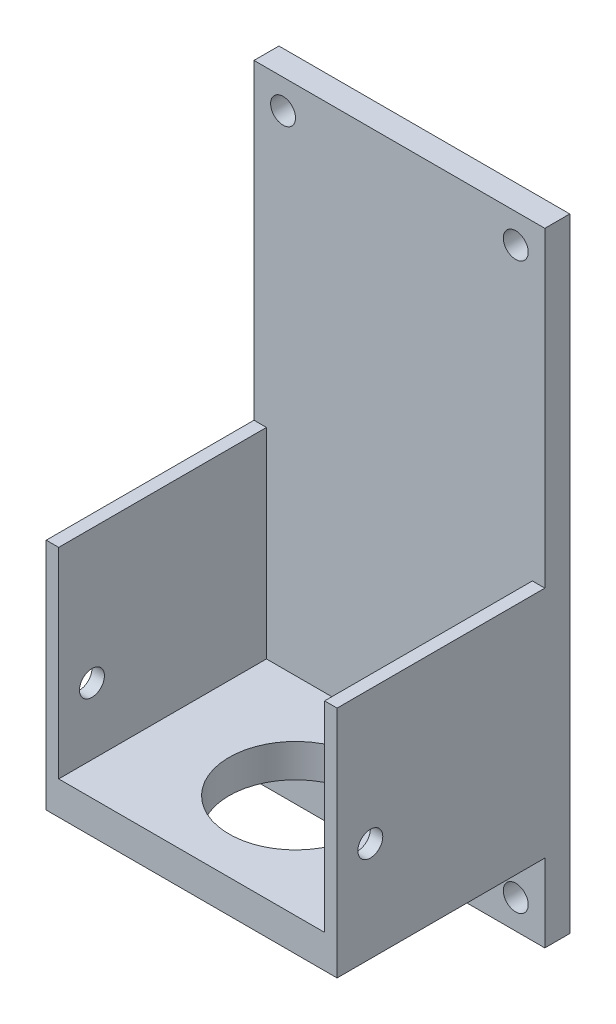
ISO-10303-21;
HEADER;
FILE_DESCRIPTION(('STEP AP214'),'2;1');
FILE_NAME('part.step','',(''),(''),'','','');
FILE_SCHEMA(('AUTOMOTIVE_DESIGN { 1 0 10303 214 1 1 1 1 }'));
ENDSEC;
DATA;
#1=APPLICATION_CONTEXT('core data for automotive mechanical design processes');
#2=APPLICATION_PROTOCOL_DEFINITION('international standard','automotive_design',2000,#1);
#3=PRODUCT_CONTEXT('',#1,'mechanical');
#4=PRODUCT('Part','Part','',(#3));
#5=PRODUCT_RELATED_PRODUCT_CATEGORY('part','',(#4));
#6=PRODUCT_DEFINITION_FORMATION('','',#4);
#7=PRODUCT_DEFINITION_CONTEXT('part definition',#1,'design');
#8=PRODUCT_DEFINITION('design','',#6,#7);
#9=PRODUCT_DEFINITION_SHAPE('','',#8);
#10=(LENGTH_UNIT() NAMED_UNIT(*) SI_UNIT(.MILLI.,.METRE.));
#11=(NAMED_UNIT(*) PLANE_ANGLE_UNIT() SI_UNIT($,.RADIAN.));
#12=(NAMED_UNIT(*) SI_UNIT($,.STERADIAN.) SOLID_ANGLE_UNIT());
#13=UNCERTAINTY_MEASURE_WITH_UNIT(LENGTH_MEASURE(1.E-05),#10,'distance_accuracy_value','');
#14=(GEOMETRIC_REPRESENTATION_CONTEXT(3) GLOBAL_UNCERTAINTY_ASSIGNED_CONTEXT((#13)) GLOBAL_UNIT_ASSIGNED_CONTEXT((#10,
#11,#12)) REPRESENTATION_CONTEXT('',''));
#15=CARTESIAN_POINT('',(0.,0.,0.));
#16=DIRECTION('',(0.,0.,1.));
#17=DIRECTION('',(1.,0.,0.));
#18=AXIS2_PLACEMENT_3D('',#15,#16,#17);
#19=CARTESIAN_POINT('',(0.,0.,3.));
#20=DIRECTION('',(0.,0.,-1.));
#21=DIRECTION('',(-1.,0.,0.));
#22=AXIS2_PLACEMENT_3D('',#19,#20,#21);
#23=PLANE('',#22);
#24=CARTESIAN_POINT('',(14.,-34.,3.));
#25=DIRECTION('',(0.,0.,1.));
#26=DIRECTION('',(1.,0.,0.));
#27=AXIS2_PLACEMENT_3D('',#24,#25,#26);
#28=CIRCLE('',#27,1.5);
#29=CARTESIAN_POINT('',(15.5,-34.,3.));
#30=VERTEX_POINT('',#29);
#31=EDGE_CURVE('E247',#30,#30,#28,.T.);
#32=ORIENTED_EDGE('',*,*,#31,.F.);
#33=EDGE_LOOP('',(#32));
#34=FACE_BOUND('',#33,.T.);
#35=CARTESIAN_POINT('',(-14.,-34.,3.));
#36=DIRECTION('',(0.,0.,1.));
#37=DIRECTION('',(1.,0.,0.));
#38=AXIS2_PLACEMENT_3D('',#35,#36,#37);
#39=CIRCLE('',#38,1.5);
#40=CARTESIAN_POINT('',(-12.5,-34.,3.));
#41=VERTEX_POINT('',#40);
#42=EDGE_CURVE('E243',#41,#41,#39,.T.);
#43=ORIENTED_EDGE('',*,*,#42,.F.);
#44=EDGE_LOOP('',(#43));
#45=FACE_BOUND('',#44,.T.);
#46=DIRECTION('',(0.,1.,0.));
#47=VECTOR('',#46,1.);
#48=CARTESIAN_POINT('',(17.5,-37.5,3.));
#49=LINE('',#48,#47);
#50=CARTESIAN_POINT('',(17.5,-37.5,3.));
#51=VERTEX_POINT('',#50);
#52=CARTESIAN_POINT('',(17.5,-28.1302809973547,3.));
#53=VERTEX_POINT('',#52);
#54=EDGE_CURVE('E260',#51,#53,#49,.T.);
#55=ORIENTED_EDGE('',*,*,#54,.T.);
#56=DIRECTION('',(1.,0.,0.));
#57=VECTOR('',#56,1.);
#58=CARTESIAN_POINT('',(-16.,-28.1302809973547,3.));
#59=LINE('',#58,#57);
#60=CARTESIAN_POINT('',(-17.5,-28.1302809973547,3.));
#61=VERTEX_POINT('',#60);
#62=EDGE_CURVE('E230',#61,#53,#59,.T.);
#63=ORIENTED_EDGE('',*,*,#62,.F.);
#64=DIRECTION('',(0.,-1.,0.));
#65=VECTOR('',#64,1.);
#66=CARTESIAN_POINT('',(-17.5,-37.5,3.));
#67=LINE('',#66,#65);
#68=CARTESIAN_POINT('',(-17.5,-37.5,3.));
#69=VERTEX_POINT('',#68);
#70=EDGE_CURVE('E266',#61,#69,#67,.T.);
#71=ORIENTED_EDGE('',*,*,#70,.T.);
#72=DIRECTION('',(1.,0.,0.));
#73=VECTOR('',#72,1.);
#74=CARTESIAN_POINT('',(-17.5,-37.5,3.));
#75=LINE('',#74,#73);
#76=EDGE_CURVE('E63',#69,#51,#75,.T.);
#77=ORIENTED_EDGE('',*,*,#76,.T.);
#78=EDGE_LOOP('',(#55,#63,#71,#77));
#79=FACE_BOUND('',#78,.T.);
#80=ADVANCED_FACE('F43',(#34,#45,#79),#23,.F.);
#81=CARTESIAN_POINT('',(-14.,34.,3.));
#82=DIRECTION('',(0.,0.,1.));
#83=DIRECTION('',(1.,0.,0.));
#84=AXIS2_PLACEMENT_3D('',#81,#82,#83);
#85=CIRCLE('',#84,1.5);
#86=CARTESIAN_POINT('',(-12.5,34.,3.));
#87=VERTEX_POINT('',#86);
#88=EDGE_CURVE('E248',#87,#87,#85,.T.);
#89=ORIENTED_EDGE('',*,*,#88,.F.);
#90=EDGE_LOOP('',(#89));
#91=FACE_BOUND('',#90,.T.);
#92=CARTESIAN_POINT('',(14.,34.,3.));
#93=DIRECTION('',(0.,0.,1.));
#94=DIRECTION('',(1.,0.,0.));
#95=AXIS2_PLACEMENT_3D('',#92,#93,#94);
#96=CIRCLE('',#95,1.5);
#97=CARTESIAN_POINT('',(15.5,34.,3.));
#98=VERTEX_POINT('',#97);
#99=EDGE_CURVE('E252',#98,#98,#96,.T.);
#100=ORIENTED_EDGE('',*,*,#99,.F.);
#101=EDGE_LOOP('',(#100));
#102=FACE_BOUND('',#101,.T.);
#103=DIRECTION('',(0.,1.,0.));
#104=VECTOR('',#103,1.);
#105=CARTESIAN_POINT('',(16.,-28.1302809973547,3.));
#106=LINE('',#105,#104);
#107=CARTESIAN_POINT('',(16.,-24.1302809973547,3.));
#108=VERTEX_POINT('',#107);
#109=CARTESIAN_POINT('',(16.,0.,3.));
#110=VERTEX_POINT('',#109);
#111=EDGE_CURVE('E161',#108,#110,#106,.T.);
#112=ORIENTED_EDGE('',*,*,#111,.T.);
#113=DIRECTION('',(-1.,0.,0.));
#114=VECTOR('',#113,1.);
#115=CARTESIAN_POINT('',(55.1339302889047,0.,3.));
#116=LINE('',#115,#114);
#117=CARTESIAN_POINT('',(17.5,0.,3.));
#118=VERTEX_POINT('',#117);
#119=EDGE_CURVE('E146',#118,#110,#116,.T.);
#120=ORIENTED_EDGE('',*,*,#119,.F.);
#121=CARTESIAN_POINT('',(17.5,37.5,3.));
#122=VERTEX_POINT('',#121);
#123=EDGE_CURVE('E95',#118,#122,#49,.T.);
#124=ORIENTED_EDGE('',*,*,#123,.T.);
#125=DIRECTION('',(-1.,0.,0.));
#126=VECTOR('',#125,1.);
#127=CARTESIAN_POINT('',(-17.5,37.5,3.));
#128=LINE('',#127,#126);
#129=CARTESIAN_POINT('',(-17.5,37.5,3.));
#130=VERTEX_POINT('',#129);
#131=EDGE_CURVE('E263',#122,#130,#128,.T.);
#132=ORIENTED_EDGE('',*,*,#131,.T.);
#133=CARTESIAN_POINT('',(-17.5,0.,3.));
#134=VERTEX_POINT('',#133);
#135=EDGE_CURVE('E267',#130,#134,#67,.T.);
#136=ORIENTED_EDGE('',*,*,#135,.T.);
#137=DIRECTION('',(1.,0.,0.));
#138=VECTOR('',#137,1.);
#139=CARTESIAN_POINT('',(-55.1339302889047,0.,3.));
#140=LINE('',#139,#138);
#141=CARTESIAN_POINT('',(-16.,0.,3.));
#142=VERTEX_POINT('',#141);
#143=EDGE_CURVE('E207',#134,#142,#140,.T.);
#144=ORIENTED_EDGE('',*,*,#143,.T.);
#145=DIRECTION('',(0.,-1.,0.));
#146=VECTOR('',#145,1.);
#147=CARTESIAN_POINT('',(-16.,-28.1302809973547,3.));
#148=LINE('',#147,#146);
#149=CARTESIAN_POINT('',(-16.,-24.1302809973547,3.));
#150=VERTEX_POINT('',#149);
#151=EDGE_CURVE('E198',#142,#150,#148,.T.);
#152=ORIENTED_EDGE('',*,*,#151,.T.);
#153=DIRECTION('',(-1.,0.,0.));
#154=VECTOR('',#153,1.);
#155=CARTESIAN_POINT('',(-16.,-24.1302809973547,3.));
#156=LINE('',#155,#154);
#157=EDGE_CURVE('E169',#108,#150,#156,.T.);
#158=ORIENTED_EDGE('',*,*,#157,.F.);
#159=EDGE_LOOP('',(#112,#120,#124,#132,#136,#144,#152,#158));
#160=FACE_BOUND('',#159,.T.);
#161=ADVANCED_FACE('F166',(#91,#102,#160),#23,.F.);
#162=CARTESIAN_POINT('',(17.5,-37.5,3.));
#163=DIRECTION('',(-1.,0.,0.));
#164=DIRECTION('',(0.,0.,1.));
#165=AXIS2_PLACEMENT_3D('',#162,#163,#164);
#166=PLANE('',#165);
#167=CARTESIAN_POINT('',(17.5,-16.1302809973547,24.));
#168=DIRECTION('',(1.,0.,0.));
#169=DIRECTION('',(0.,0.,-1.));
#170=AXIS2_PLACEMENT_3D('',#167,#168,#169);
#171=CIRCLE('',#170,1.5);
#172=CARTESIAN_POINT('',(17.5,-16.1302809973547,22.5));
#173=VERTEX_POINT('',#172);
#174=EDGE_CURVE('E342',#173,#173,#171,.T.);
#175=ORIENTED_EDGE('',*,*,#174,.F.);
#176=EDGE_LOOP('',(#175));
#177=FACE_BOUND('',#176,.T.);
#178=DIRECTION('',(0.,1.,0.));
#179=VECTOR('',#178,1.);
#180=CARTESIAN_POINT('',(17.5,-37.5,0.));
#181=LINE('',#180,#179);
#182=CARTESIAN_POINT('',(17.5,-37.5,0.));
#183=VERTEX_POINT('',#182);
#184=CARTESIAN_POINT('',(17.5,37.5,0.));
#185=VERTEX_POINT('',#184);
#186=EDGE_CURVE('E274',#183,#185,#181,.T.);
#187=ORIENTED_EDGE('',*,*,#186,.T.);
#188=DIRECTION('',(0.,0.,-1.));
#189=VECTOR('',#188,1.);
#190=CARTESIAN_POINT('',(17.5,37.5,3.));
#191=LINE('',#190,#189);
#192=EDGE_CURVE('E11',#122,#185,#191,.T.);
#193=ORIENTED_EDGE('',*,*,#192,.F.);
#194=ORIENTED_EDGE('',*,*,#123,.F.);
#195=DIRECTION('',(0.,0.,-1.));
#196=VECTOR('',#195,1.);
#197=CARTESIAN_POINT('',(17.5,0.,3.));
#198=LINE('',#197,#196);
#199=CARTESIAN_POINT('',(17.5,0.,28.));
#200=VERTEX_POINT('',#199);
#201=EDGE_CURVE('E152',#200,#118,#198,.T.);
#202=ORIENTED_EDGE('',*,*,#201,.F.);
#203=DIRECTION('',(0.,1.,0.));
#204=VECTOR('',#203,1.);
#205=CARTESIAN_POINT('',(17.5,-28.1302809973547,28.));
#206=LINE('',#205,#204);
#207=CARTESIAN_POINT('',(17.5,-28.1302809973547,28.));
#208=VERTEX_POINT('',#207);
#209=EDGE_CURVE('E187',#208,#200,#206,.T.);
#210=ORIENTED_EDGE('',*,*,#209,.F.);
#211=DIRECTION('',(0.,0.,1.));
#212=VECTOR('',#211,1.);
#213=CARTESIAN_POINT('',(17.5,-28.1302809973547,3.));
#214=LINE('',#213,#212);
#215=EDGE_CURVE('E155',#53,#208,#214,.T.);
#216=ORIENTED_EDGE('',*,*,#215,.F.);
#217=ORIENTED_EDGE('',*,*,#54,.F.);
#218=DIRECTION('',(0.,0.,-1.));
#219=VECTOR('',#218,1.);
#220=CARTESIAN_POINT('',(17.5,-37.5,3.));
#221=LINE('',#220,#219);
#222=EDGE_CURVE('E273',#51,#183,#221,.T.);
#223=ORIENTED_EDGE('',*,*,#222,.T.);
#224=EDGE_LOOP('',(#187,#193,#194,#202,#210,#216,#217,#223));
#225=FACE_BOUND('',#224,.T.);
#226=ADVANCED_FACE('F45',(#177,#225),#166,.F.);
#227=CARTESIAN_POINT('',(-17.5,37.5,3.));
#228=DIRECTION('',(0.,-1.,0.));
#229=DIRECTION('',(0.,0.,-1.));
#230=AXIS2_PLACEMENT_3D('',#227,#228,#229);
#231=PLANE('',#230);
#232=DIRECTION('',(-1.,0.,0.));
#233=VECTOR('',#232,1.);
#234=CARTESIAN_POINT('',(-17.5,37.5,0.));
#235=LINE('',#234,#233);
#236=CARTESIAN_POINT('',(-17.5,37.5,0.));
#237=VERTEX_POINT('',#236);
#238=EDGE_CURVE('E278',#185,#237,#235,.T.);
#239=ORIENTED_EDGE('',*,*,#238,.T.);
#240=DIRECTION('',(0.,0.,-1.));
#241=VECTOR('',#240,1.);
#242=CARTESIAN_POINT('',(-17.5,37.5,3.));
#243=LINE('',#242,#241);
#244=EDGE_CURVE('E54',#130,#237,#243,.T.);
#245=ORIENTED_EDGE('',*,*,#244,.F.);
#246=ORIENTED_EDGE('',*,*,#131,.F.);
#247=ORIENTED_EDGE('',*,*,#192,.T.);
#248=EDGE_LOOP('',(#239,#245,#246,#247));
#249=FACE_BOUND('',#248,.T.);
#250=ADVANCED_FACE('F384',(#249),#231,.F.);
#251=CARTESIAN_POINT('',(-17.5,-37.5,3.));
#252=DIRECTION('',(1.,0.,0.));
#253=DIRECTION('',(0.,0.,-1.));
#254=AXIS2_PLACEMENT_3D('',#251,#252,#253);
#255=PLANE('',#254);
#256=CARTESIAN_POINT('',(-17.5,-16.1302809973547,24.));
#257=DIRECTION('',(1.,0.,0.));
#258=DIRECTION('',(0.,0.,-1.));
#259=AXIS2_PLACEMENT_3D('',#256,#257,#258);
#260=CIRCLE('',#259,1.5);
#261=CARTESIAN_POINT('',(-17.5,-16.1302809973547,22.5));
#262=VERTEX_POINT('',#261);
#263=EDGE_CURVE('E346',#262,#262,#260,.T.);
#264=ORIENTED_EDGE('',*,*,#263,.T.);
#265=EDGE_LOOP('',(#264));
#266=FACE_BOUND('',#265,.T.);
#267=DIRECTION('',(0.,-1.,0.));
#268=VECTOR('',#267,1.);
#269=CARTESIAN_POINT('',(-17.5,-37.5,0.));
#270=LINE('',#269,#268);
#271=CARTESIAN_POINT('',(-17.5,-37.5,0.));
#272=VERTEX_POINT('',#271);
#273=EDGE_CURVE('E81',#237,#272,#270,.T.);
#274=ORIENTED_EDGE('',*,*,#273,.T.);
#275=DIRECTION('',(0.,0.,-1.));
#276=VECTOR('',#275,1.);
#277=CARTESIAN_POINT('',(-17.5,-37.5,3.));
#278=LINE('',#277,#276);
#279=EDGE_CURVE('E288',#69,#272,#278,.T.);
#280=ORIENTED_EDGE('',*,*,#279,.F.);
#281=ORIENTED_EDGE('',*,*,#70,.F.);
#282=DIRECTION('',(0.,0.,-1.));
#283=VECTOR('',#282,1.);
#284=CARTESIAN_POINT('',(-17.5,-28.1302809973547,3.));
#285=LINE('',#284,#283);
#286=CARTESIAN_POINT('',(-17.5,-28.1302809973547,28.));
#287=VERTEX_POINT('',#286);
#288=EDGE_CURVE('E192',#287,#61,#285,.T.);
#289=ORIENTED_EDGE('',*,*,#288,.F.);
#290=DIRECTION('',(0.,-1.,0.));
#291=VECTOR('',#290,1.);
#292=CARTESIAN_POINT('',(-17.5,-28.1302809973547,28.));
#293=LINE('',#292,#291);
#294=CARTESIAN_POINT('',(-17.5,0.,28.));
#295=VERTEX_POINT('',#294);
#296=EDGE_CURVE('E188',#295,#287,#293,.T.);
#297=ORIENTED_EDGE('',*,*,#296,.F.);
#298=DIRECTION('',(0.,0.,1.));
#299=VECTOR('',#298,1.);
#300=CARTESIAN_POINT('',(-17.5,0.,3.));
#301=LINE('',#300,#299);
#302=EDGE_CURVE('E193',#134,#295,#301,.T.);
#303=ORIENTED_EDGE('',*,*,#302,.F.);
#304=ORIENTED_EDGE('',*,*,#135,.F.);
#305=ORIENTED_EDGE('',*,*,#244,.T.);
#306=EDGE_LOOP('',(#274,#280,#281,#289,#297,#303,#304,#305));
#307=FACE_BOUND('',#306,.T.);
#308=ADVANCED_FACE('F328',(#266,#307),#255,.F.);
#309=CARTESIAN_POINT('',(-17.5,-37.5,3.));
#310=DIRECTION('',(0.,1.,0.));
#311=DIRECTION('',(0.,0.,1.));
#312=AXIS2_PLACEMENT_3D('',#309,#310,#311);
#313=PLANE('',#312);
#314=DIRECTION('',(1.,0.,0.));
#315=VECTOR('',#314,1.);
#316=CARTESIAN_POINT('',(-17.5,-37.5,0.));
#317=LINE('',#316,#315);
#318=EDGE_CURVE('E87',#272,#183,#317,.T.);
#319=ORIENTED_EDGE('',*,*,#318,.T.);
#320=ORIENTED_EDGE('',*,*,#222,.F.);
#321=ORIENTED_EDGE('',*,*,#76,.F.);
#322=ORIENTED_EDGE('',*,*,#279,.T.);
#323=EDGE_LOOP('',(#319,#320,#321,#322));
#324=FACE_BOUND('',#323,.T.);
#325=ADVANCED_FACE('F314',(#324),#313,.F.);
#326=CARTESIAN_POINT('',(0.,0.,0.));
#327=DIRECTION('',(0.,0.,-1.));
#328=DIRECTION('',(-1.,0.,0.));
#329=AXIS2_PLACEMENT_3D('',#326,#327,#328);
#330=PLANE('',#329);
#331=CARTESIAN_POINT('',(-14.,34.,0.));
#332=DIRECTION('',(0.,0.,-1.));
#333=DIRECTION('',(-1.,0.,0.));
#334=AXIS2_PLACEMENT_3D('',#331,#332,#333);
#335=CIRCLE('',#334,1.5);
#336=CARTESIAN_POINT('',(-15.5,34.,0.));
#337=VERTEX_POINT('',#336);
#338=EDGE_CURVE('E279',#337,#337,#335,.T.);
#339=ORIENTED_EDGE('',*,*,#338,.F.);
#340=EDGE_LOOP('',(#339));
#341=FACE_BOUND('',#340,.T.);
#342=CARTESIAN_POINT('',(14.,-34.,0.));
#343=DIRECTION('',(0.,0.,-1.));
#344=DIRECTION('',(-1.,0.,0.));
#345=AXIS2_PLACEMENT_3D('',#342,#343,#344);
#346=CIRCLE('',#345,1.5);
#347=CARTESIAN_POINT('',(12.5,-34.,0.));
#348=VERTEX_POINT('',#347);
#349=EDGE_CURVE('E300',#348,#348,#346,.T.);
#350=ORIENTED_EDGE('',*,*,#349,.F.);
#351=EDGE_LOOP('',(#350));
#352=FACE_BOUND('',#351,.T.);
#353=CARTESIAN_POINT('',(-14.,-34.,0.));
#354=DIRECTION('',(0.,0.,-1.));
#355=DIRECTION('',(-1.,0.,0.));
#356=AXIS2_PLACEMENT_3D('',#353,#354,#355);
#357=CIRCLE('',#356,1.5);
#358=CARTESIAN_POINT('',(-15.5,-34.,0.));
#359=VERTEX_POINT('',#358);
#360=EDGE_CURVE('E296',#359,#359,#357,.T.);
#361=ORIENTED_EDGE('',*,*,#360,.F.);
#362=EDGE_LOOP('',(#361));
#363=FACE_BOUND('',#362,.T.);
#364=CARTESIAN_POINT('',(14.,34.,0.));
#365=DIRECTION('',(0.,0.,-1.));
#366=DIRECTION('',(-1.,0.,0.));
#367=AXIS2_PLACEMENT_3D('',#364,#365,#366);
#368=CIRCLE('',#367,1.5);
#369=CARTESIAN_POINT('',(12.5,34.,0.));
#370=VERTEX_POINT('',#369);
#371=EDGE_CURVE('E259',#370,#370,#368,.T.);
#372=ORIENTED_EDGE('',*,*,#371,.F.);
#373=EDGE_LOOP('',(#372));
#374=FACE_BOUND('',#373,.T.);
#375=ORIENTED_EDGE('',*,*,#186,.F.);
#376=ORIENTED_EDGE('',*,*,#318,.F.);
#377=ORIENTED_EDGE('',*,*,#273,.F.);
#378=ORIENTED_EDGE('',*,*,#238,.F.);
#379=EDGE_LOOP('',(#375,#376,#377,#378));
#380=FACE_BOUND('',#379,.T.);
#381=ADVANCED_FACE('F310',(#341,#352,#363,#374,#380),#330,.T.);
#382=CARTESIAN_POINT('',(14.,34.,-10.));
#383=DIRECTION('',(0.,0.,1.));
#384=DIRECTION('',(1.,0.,0.));
#385=AXIS2_PLACEMENT_3D('',#382,#383,#384);
#386=CYLINDRICAL_SURFACE('',#385,1.5);
#387=ORIENTED_EDGE('',*,*,#371,.T.);
#388=EDGE_LOOP('',(#387));
#389=FACE_BOUND('',#388,.T.);
#390=ORIENTED_EDGE('',*,*,#99,.T.);
#391=EDGE_LOOP('',(#390));
#392=FACE_BOUND('',#391,.T.);
#393=ADVANCED_FACE('F313',(#389,#392),#386,.F.);
#394=CARTESIAN_POINT('',(-14.,-34.,-10.));
#395=DIRECTION('',(0.,0.,1.));
#396=DIRECTION('',(1.,0.,0.));
#397=AXIS2_PLACEMENT_3D('',#394,#395,#396);
#398=CYLINDRICAL_SURFACE('',#397,1.5);
#399=ORIENTED_EDGE('',*,*,#360,.T.);
#400=EDGE_LOOP('',(#399));
#401=FACE_BOUND('',#400,.T.);
#402=ORIENTED_EDGE('',*,*,#42,.T.);
#403=EDGE_LOOP('',(#402));
#404=FACE_BOUND('',#403,.T.);
#405=ADVANCED_FACE('F417',(#401,#404),#398,.F.);
#406=CARTESIAN_POINT('',(14.,-34.,-10.));
#407=DIRECTION('',(0.,0.,1.));
#408=DIRECTION('',(1.,0.,0.));
#409=AXIS2_PLACEMENT_3D('',#406,#407,#408);
#410=CYLINDRICAL_SURFACE('',#409,1.5);
#411=ORIENTED_EDGE('',*,*,#349,.T.);
#412=EDGE_LOOP('',(#411));
#413=FACE_BOUND('',#412,.T.);
#414=ORIENTED_EDGE('',*,*,#31,.T.);
#415=EDGE_LOOP('',(#414));
#416=FACE_BOUND('',#415,.T.);
#417=ADVANCED_FACE('F413',(#413,#416),#410,.F.);
#418=CARTESIAN_POINT('',(-14.,34.,-10.));
#419=DIRECTION('',(0.,0.,1.));
#420=DIRECTION('',(1.,0.,0.));
#421=AXIS2_PLACEMENT_3D('',#418,#419,#420);
#422=CYLINDRICAL_SURFACE('',#421,1.5);
#423=ORIENTED_EDGE('',*,*,#338,.T.);
#424=EDGE_LOOP('',(#423));
#425=FACE_BOUND('',#424,.T.);
#426=ORIENTED_EDGE('',*,*,#88,.T.);
#427=EDGE_LOOP('',(#426));
#428=FACE_BOUND('',#427,.T.);
#429=ADVANCED_FACE('F307',(#425,#428),#422,.F.);
#430=CARTESIAN_POINT('',(-16.,-24.1302809973547,28.));
#431=DIRECTION('',(0.,-1.,0.));
#432=DIRECTION('',(0.,0.,-1.));
#433=AXIS2_PLACEMENT_3D('',#430,#431,#432);
#434=PLANE('',#433);
#435=CARTESIAN_POINT('',(0.,-24.1302809973547,15.5));
#436=DIRECTION('',(0.,-1.,0.));
#437=DIRECTION('',(0.,0.,-1.));
#438=AXIS2_PLACEMENT_3D('',#435,#436,#437);
#439=CIRCLE('',#438,8.);
#440=CARTESIAN_POINT('',(0.,-24.1302809973547,7.5));
#441=VERTEX_POINT('',#440);
#442=EDGE_CURVE('E221',#441,#441,#439,.T.);
#443=ORIENTED_EDGE('',*,*,#442,.T.);
#444=EDGE_LOOP('',(#443));
#445=FACE_BOUND('',#444,.T.);
#446=ORIENTED_EDGE('',*,*,#157,.T.);
#447=DIRECTION('',(0.,0.,-1.));
#448=VECTOR('',#447,1.);
#449=CARTESIAN_POINT('',(-16.,-24.1302809973547,28.));
#450=LINE('',#449,#448);
#451=CARTESIAN_POINT('',(-16.,-24.1302809973547,28.));
#452=VERTEX_POINT('',#451);
#453=EDGE_CURVE('E233',#452,#150,#450,.T.);
#454=ORIENTED_EDGE('',*,*,#453,.F.);
#455=DIRECTION('',(-1.,0.,0.));
#456=VECTOR('',#455,1.);
#457=CARTESIAN_POINT('',(-16.,-24.1302809973547,28.));
#458=LINE('',#457,#456);
#459=CARTESIAN_POINT('',(16.,-24.1302809973547,28.));
#460=VERTEX_POINT('',#459);
#461=EDGE_CURVE('E225',#460,#452,#458,.T.);
#462=ORIENTED_EDGE('',*,*,#461,.F.);
#463=DIRECTION('',(0.,0.,-1.));
#464=VECTOR('',#463,1.);
#465=CARTESIAN_POINT('',(16.,-24.1302809973547,28.));
#466=LINE('',#465,#464);
#467=EDGE_CURVE('E240',#460,#108,#466,.T.);
#468=ORIENTED_EDGE('',*,*,#467,.T.);
#469=EDGE_LOOP('',(#446,#454,#462,#468));
#470=FACE_BOUND('',#469,.T.);
#471=ADVANCED_FACE('F403',(#445,#470),#434,.F.);
#472=CARTESIAN_POINT('',(-16.,-28.1302809973547,28.));
#473=DIRECTION('',(0.,1.,0.));
#474=DIRECTION('',(0.,0.,1.));
#475=AXIS2_PLACEMENT_3D('',#472,#473,#474);
#476=PLANE('',#475);
#477=CARTESIAN_POINT('',(0.,-28.1302809973547,15.5));
#478=DIRECTION('',(0.,-1.,0.));
#479=DIRECTION('',(0.,0.,-1.));
#480=AXIS2_PLACEMENT_3D('',#477,#478,#479);
#481=CIRCLE('',#480,8.);
#482=CARTESIAN_POINT('',(0.,-28.1302809973547,7.5));
#483=VERTEX_POINT('',#482);
#484=EDGE_CURVE('E197',#483,#483,#481,.T.);
#485=ORIENTED_EDGE('',*,*,#484,.F.);
#486=EDGE_LOOP('',(#485));
#487=FACE_BOUND('',#486,.T.);
#488=ORIENTED_EDGE('',*,*,#62,.T.);
#489=ORIENTED_EDGE('',*,*,#215,.T.);
#490=DIRECTION('',(1.,0.,0.));
#491=VECTOR('',#490,1.);
#492=CARTESIAN_POINT('',(-16.,-28.1302809973547,28.));
#493=LINE('',#492,#491);
#494=EDGE_CURVE('E229',#287,#208,#493,.T.);
#495=ORIENTED_EDGE('',*,*,#494,.F.);
#496=ORIENTED_EDGE('',*,*,#288,.T.);
#497=EDGE_LOOP('',(#488,#489,#495,#496));
#498=FACE_BOUND('',#497,.T.);
#499=ADVANCED_FACE('F333',(#487,#498),#476,.F.);
#500=CARTESIAN_POINT('',(0.,0.,28.));
#501=DIRECTION('',(0.,0.,-1.));
#502=DIRECTION('',(-1.,0.,0.));
#503=AXIS2_PLACEMENT_3D('',#500,#501,#502);
#504=PLANE('',#503);
#505=ORIENTED_EDGE('',*,*,#494,.T.);
#506=ORIENTED_EDGE('',*,*,#209,.T.);
#507=DIRECTION('',(-1.,0.,0.));
#508=VECTOR('',#507,1.);
#509=CARTESIAN_POINT('',(55.1339302889047,0.,28.));
#510=LINE('',#509,#508);
#511=CARTESIAN_POINT('',(16.,0.,28.));
#512=VERTEX_POINT('',#511);
#513=EDGE_CURVE('E156',#200,#512,#510,.T.);
#514=ORIENTED_EDGE('',*,*,#513,.T.);
#515=DIRECTION('',(0.,-1.,0.));
#516=VECTOR('',#515,1.);
#517=CARTESIAN_POINT('',(16.,-28.1302809973547,28.));
#518=LINE('',#517,#516);
#519=EDGE_CURVE('E163',#512,#460,#518,.T.);
#520=ORIENTED_EDGE('',*,*,#519,.T.);
#521=ORIENTED_EDGE('',*,*,#461,.T.);
#522=DIRECTION('',(0.,1.,0.));
#523=VECTOR('',#522,1.);
#524=CARTESIAN_POINT('',(-16.,-28.1302809973547,28.));
#525=LINE('',#524,#523);
#526=CARTESIAN_POINT('',(-16.,0.,28.));
#527=VERTEX_POINT('',#526);
#528=EDGE_CURVE('E201',#452,#527,#525,.T.);
#529=ORIENTED_EDGE('',*,*,#528,.T.);
#530=DIRECTION('',(1.,0.,0.));
#531=VECTOR('',#530,1.);
#532=CARTESIAN_POINT('',(-55.1339302889047,0.,28.));
#533=LINE('',#532,#531);
#534=EDGE_CURVE('E211',#295,#527,#533,.T.);
#535=ORIENTED_EDGE('',*,*,#534,.F.);
#536=ORIENTED_EDGE('',*,*,#296,.T.);
#537=EDGE_LOOP('',(#505,#506,#514,#520,#521,#529,#535,#536));
#538=FACE_BOUND('',#537,.T.);
#539=ADVANCED_FACE('F337',(#538),#504,.F.);
#540=CARTESIAN_POINT('',(0.,-23.1302809973547,15.5));
#541=DIRECTION('',(0.,-1.,0.));
#542=DIRECTION('',(0.,0.,-1.));
#543=AXIS2_PLACEMENT_3D('',#540,#541,#542);
#544=CYLINDRICAL_SURFACE('',#543,8.);
#545=ORIENTED_EDGE('',*,*,#484,.T.);
#546=EDGE_LOOP('',(#545));
#547=FACE_BOUND('',#546,.T.);
#548=ORIENTED_EDGE('',*,*,#442,.F.);
#549=EDGE_LOOP('',(#548));
#550=FACE_BOUND('',#549,.T.);
#551=ADVANCED_FACE('F439',(#547,#550),#544,.F.);
#552=CARTESIAN_POINT('',(-16.,0.,0.));
#553=DIRECTION('',(1.,0.,0.));
#554=DIRECTION('',(0.,0.,-1.));
#555=AXIS2_PLACEMENT_3D('',#552,#553,#554);
#556=PLANE('',#555);
#557=CARTESIAN_POINT('',(-16.,-16.1302809973547,24.));
#558=DIRECTION('',(1.,0.,0.));
#559=DIRECTION('',(0.,0.,-1.));
#560=AXIS2_PLACEMENT_3D('',#557,#558,#559);
#561=CIRCLE('',#560,1.5);
#562=CARTESIAN_POINT('',(-16.,-16.1302809973547,22.5));
#563=VERTEX_POINT('',#562);
#564=EDGE_CURVE('E172',#563,#563,#561,.T.);
#565=ORIENTED_EDGE('',*,*,#564,.F.);
#566=EDGE_LOOP('',(#565));
#567=FACE_BOUND('',#566,.T.);
#568=ORIENTED_EDGE('',*,*,#453,.T.);
#569=ORIENTED_EDGE('',*,*,#151,.F.);
#570=DIRECTION('',(0.,0.,-1.));
#571=VECTOR('',#570,1.);
#572=CARTESIAN_POINT('',(-16.,0.,3.));
#573=LINE('',#572,#571);
#574=EDGE_CURVE('E204',#527,#142,#573,.T.);
#575=ORIENTED_EDGE('',*,*,#574,.F.);
#576=ORIENTED_EDGE('',*,*,#528,.F.);
#577=EDGE_LOOP('',(#568,#569,#575,#576));
#578=FACE_BOUND('',#577,.T.);
#579=ADVANCED_FACE('F399',(#567,#578),#556,.T.);
#580=CARTESIAN_POINT('',(-55.1339302889047,0.,3.));
#581=DIRECTION('',(0.,-1.,0.));
#582=DIRECTION('',(0.,0.,-1.));
#583=AXIS2_PLACEMENT_3D('',#580,#581,#582);
#584=PLANE('',#583);
#585=ORIENTED_EDGE('',*,*,#143,.F.);
#586=ORIENTED_EDGE('',*,*,#302,.T.);
#587=ORIENTED_EDGE('',*,*,#534,.T.);
#588=ORIENTED_EDGE('',*,*,#574,.T.);
#589=EDGE_LOOP('',(#585,#586,#587,#588));
#590=FACE_BOUND('',#589,.T.);
#591=ADVANCED_FACE('F396',(#590),#584,.F.);
#592=CARTESIAN_POINT('',(16.,0.,0.));
#593=DIRECTION('',(1.,0.,0.));
#594=DIRECTION('',(0.,0.,-1.));
#595=AXIS2_PLACEMENT_3D('',#592,#593,#594);
#596=PLANE('',#595);
#597=CARTESIAN_POINT('',(16.,-16.1302809973547,24.));
#598=DIRECTION('',(1.,0.,0.));
#599=DIRECTION('',(0.,0.,-1.));
#600=AXIS2_PLACEMENT_3D('',#597,#598,#599);
#601=CIRCLE('',#600,1.5);
#602=CARTESIAN_POINT('',(16.,-16.1302809973547,22.5));
#603=VERTEX_POINT('',#602);
#604=EDGE_CURVE('E47',#603,#603,#601,.T.);
#605=ORIENTED_EDGE('',*,*,#604,.T.);
#606=EDGE_LOOP('',(#605));
#607=FACE_BOUND('',#606,.T.);
#608=ORIENTED_EDGE('',*,*,#111,.F.);
#609=ORIENTED_EDGE('',*,*,#467,.F.);
#610=ORIENTED_EDGE('',*,*,#519,.F.);
#611=DIRECTION('',(0.,0.,1.));
#612=VECTOR('',#611,1.);
#613=CARTESIAN_POINT('',(16.,0.,3.));
#614=LINE('',#613,#612);
#615=EDGE_CURVE('E150',#110,#512,#614,.T.);
#616=ORIENTED_EDGE('',*,*,#615,.F.);
#617=EDGE_LOOP('',(#608,#609,#610,#616));
#618=FACE_BOUND('',#617,.T.);
#619=ADVANCED_FACE('F159',(#607,#618),#596,.F.);
#620=CARTESIAN_POINT('',(55.1339302889047,0.,3.));
#621=DIRECTION('',(0.,-1.,0.));
#622=DIRECTION('',(0.,0.,-1.));
#623=AXIS2_PLACEMENT_3D('',#620,#621,#622);
#624=PLANE('',#623);
#625=ORIENTED_EDGE('',*,*,#513,.F.);
#626=ORIENTED_EDGE('',*,*,#201,.T.);
#627=ORIENTED_EDGE('',*,*,#119,.T.);
#628=ORIENTED_EDGE('',*,*,#615,.T.);
#629=EDGE_LOOP('',(#625,#626,#627,#628));
#630=FACE_BOUND('',#629,.T.);
#631=ADVANCED_FACE('F149',(#630),#624,.F.);
#632=CARTESIAN_POINT('',(-17.5,-16.1302809973547,24.));
#633=DIRECTION('',(1.,0.,0.));
#634=DIRECTION('',(0.,0.,-1.));
#635=AXIS2_PLACEMENT_3D('',#632,#633,#634);
#636=CYLINDRICAL_SURFACE('',#635,1.5);
#637=ORIENTED_EDGE('',*,*,#174,.T.);
#638=EDGE_LOOP('',(#637));
#639=FACE_BOUND('',#638,.T.);
#640=ORIENTED_EDGE('',*,*,#604,.F.);
#641=EDGE_LOOP('',(#640));
#642=FACE_BOUND('',#641,.T.);
#643=ADVANCED_FACE('F356',(#639,#642),#636,.F.);
#644=ORIENTED_EDGE('',*,*,#564,.T.);
#645=EDGE_LOOP('',(#644));
#646=FACE_BOUND('',#645,.T.);
#647=ORIENTED_EDGE('',*,*,#263,.F.);
#648=EDGE_LOOP('',(#647));
#649=FACE_BOUND('',#648,.T.);
#650=ADVANCED_FACE('F358',(#646,#649),#636,.F.);
#651=CLOSED_SHELL('',(#80,#161,#226,#250,#308,#325,#381,#393,#405,#417,#429,#471,#499,#539,#551,
#579,#591,#619,#631,#643,#650));
#652=MANIFOLD_SOLID_BREP('B2',#651);
#653=ADVANCED_BREP_SHAPE_REPRESENTATION('',(#18,#652),#14);
#654=SHAPE_DEFINITION_REPRESENTATION(#9,#653);
ENDSEC;
END-ISO-10303-21;
